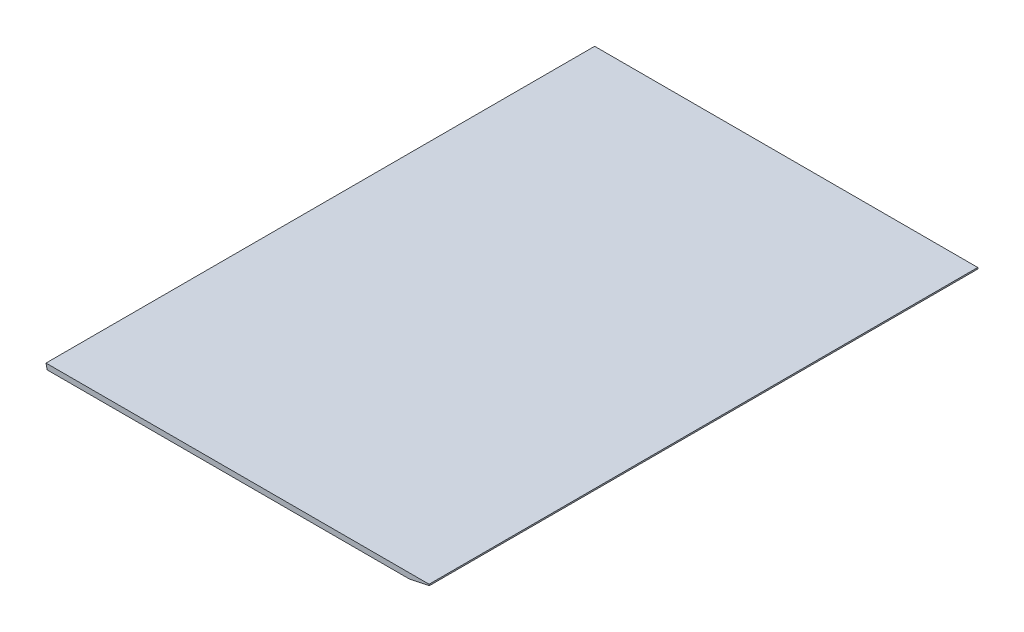
ISO-10303-21;
HEADER;
FILE_DESCRIPTION(('STEP AP214'),'2;1');
FILE_NAME('part.step','',(''),(''),'','','');
FILE_SCHEMA(('AUTOMOTIVE_DESIGN { 1 0 10303 214 1 1 1 1 }'));
ENDSEC;
DATA;
#1=APPLICATION_CONTEXT('core data for automotive mechanical design processes');
#2=APPLICATION_PROTOCOL_DEFINITION('international standard','automotive_design',2000,#1);
#3=PRODUCT_CONTEXT('',#1,'mechanical');
#4=PRODUCT('Part','Part','',(#3));
#5=PRODUCT_RELATED_PRODUCT_CATEGORY('part','',(#4));
#6=PRODUCT_DEFINITION_FORMATION('','',#4);
#7=PRODUCT_DEFINITION_CONTEXT('part definition',#1,'design');
#8=PRODUCT_DEFINITION('design','',#6,#7);
#9=PRODUCT_DEFINITION_SHAPE('','',#8);
#10=(LENGTH_UNIT() NAMED_UNIT(*) SI_UNIT(.MILLI.,.METRE.));
#11=(NAMED_UNIT(*) PLANE_ANGLE_UNIT() SI_UNIT($,.RADIAN.));
#12=(NAMED_UNIT(*) SI_UNIT($,.STERADIAN.) SOLID_ANGLE_UNIT());
#13=UNCERTAINTY_MEASURE_WITH_UNIT(LENGTH_MEASURE(1.E-05),#10,'distance_accuracy_value','');
#14=(GEOMETRIC_REPRESENTATION_CONTEXT(3) GLOBAL_UNCERTAINTY_ASSIGNED_CONTEXT((#13)) GLOBAL_UNIT_ASSIGNED_CONTEXT((#10,
#11,#12)) REPRESENTATION_CONTEXT('',''));
#15=CARTESIAN_POINT('',(0.,0.,0.));
#16=DIRECTION('',(0.,0.,1.));
#17=DIRECTION('',(1.,0.,0.));
#18=AXIS2_PLACEMENT_3D('',#15,#16,#17);
#19=CARTESIAN_POINT('',(-432.054,11.90625,-609.6));
#20=DIRECTION('',(0.,0.,1.));
#21=DIRECTION('',(1.,0.,0.));
#22=AXIS2_PLACEMENT_3D('',#19,#20,#21);
#23=PLANE('',#22);
#24=DIRECTION('',(-1.,0.,0.));
#25=VECTOR('',#24,1.);
#26=CARTESIAN_POINT('',(-432.054,11.90625,-609.6));
#27=LINE('',#26,#25);
#28=CARTESIAN_POINT('',(419.192503686376,11.90625,-609.6));
#29=VERTEX_POINT('',#28);
#30=CARTESIAN_POINT('',(-432.054,11.90625,-609.6));
#31=VERTEX_POINT('',#30);
#32=EDGE_CURVE('E111',#29,#31,#27,.T.);
#33=ORIENTED_EDGE('',*,*,#32,.F.);
#34=DIRECTION('',(-0.207554642269286,0.978223425640824,0.));
#35=VECTOR('',#34,1.);
#36=CARTESIAN_POINT('',(419.747516344646,9.29042614796967,-609.6));
#37=LINE('',#36,#35);
#38=CARTESIAN_POINT('',(419.747516344646,9.29042614796967,-609.6));
#39=VERTEX_POINT('',#38);
#40=EDGE_CURVE('E91',#39,#29,#37,.T.);
#41=ORIENTED_EDGE('',*,*,#40,.F.);
#42=DIRECTION('',(-0.978147600733805,-0.207911690817761,0.));
#43=VECTOR('',#42,1.);
#44=CARTESIAN_POINT('',(432.054,11.9062500000001,-609.6));
#45=LINE('',#44,#43);
#46=CARTESIAN_POINT('',(376.039497759022,0.,-609.6));
#47=VERTEX_POINT('',#46);
#48=EDGE_CURVE('E124',#39,#47,#45,.T.);
#49=ORIENTED_EDGE('',*,*,#48,.T.);
#50=DIRECTION('',(-1.,0.,0.));
#51=VECTOR('',#50,1.);
#52=CARTESIAN_POINT('',(-432.054,0.,-609.6));
#53=LINE('',#52,#51);
#54=CARTESIAN_POINT('',(-429.523248437616,0.,-609.6));
#55=VERTEX_POINT('',#54);
#56=EDGE_CURVE('E115',#47,#55,#53,.T.);
#57=ORIENTED_EDGE('',*,*,#56,.T.);
#58=DIRECTION('',(-0.207911690817751,0.978147600733807,0.));
#59=VECTOR('',#58,1.);
#60=CARTESIAN_POINT('',(-432.054,11.9062500000005,-609.6));
#61=LINE('',#60,#59);
#62=EDGE_CURVE('E121',#55,#31,#61,.T.);
#63=ORIENTED_EDGE('',*,*,#62,.T.);
#64=EDGE_LOOP('',(#33,#41,#49,#57,#63));
#65=FACE_BOUND('',#64,.T.);
#66=ADVANCED_FACE('F41',(#65),#23,.F.);
#67=CARTESIAN_POINT('',(-432.054,11.90625,609.6));
#68=DIRECTION('',(0.,0.,-1.));
#69=DIRECTION('',(-1.,0.,0.));
#70=AXIS2_PLACEMENT_3D('',#67,#68,#69);
#71=PLANE('',#70);
#72=DIRECTION('',(0.978147600733805,0.207911690817761,0.));
#73=VECTOR('',#72,1.);
#74=CARTESIAN_POINT('',(432.054,11.9062500000001,609.6));
#75=LINE('',#74,#73);
#76=CARTESIAN_POINT('',(376.039497759022,0.,609.6));
#77=VERTEX_POINT('',#76);
#78=CARTESIAN_POINT('',(419.747516344646,9.29042614796967,609.6));
#79=VERTEX_POINT('',#78);
#80=EDGE_CURVE('E11',#77,#79,#75,.T.);
#81=ORIENTED_EDGE('',*,*,#80,.T.);
#82=DIRECTION('',(-0.207554642269286,0.978223425640824,0.));
#83=VECTOR('',#82,1.);
#84=CARTESIAN_POINT('',(419.747516344646,9.29042614796967,609.6));
#85=LINE('',#84,#83);
#86=CARTESIAN_POINT('',(419.192503686376,11.90625,609.6));
#87=VERTEX_POINT('',#86);
#88=EDGE_CURVE('E57',#79,#87,#85,.T.);
#89=ORIENTED_EDGE('',*,*,#88,.T.);
#90=DIRECTION('',(1.,0.,0.));
#91=VECTOR('',#90,1.);
#92=CARTESIAN_POINT('',(-432.054,11.90625,609.6));
#93=LINE('',#92,#91);
#94=CARTESIAN_POINT('',(-432.054,11.90625,609.6));
#95=VERTEX_POINT('',#94);
#96=EDGE_CURVE('E100',#95,#87,#93,.T.);
#97=ORIENTED_EDGE('',*,*,#96,.F.);
#98=DIRECTION('',(0.207911690817751,-0.978147600733807,0.));
#99=VECTOR('',#98,1.);
#100=CARTESIAN_POINT('',(-432.054,11.9062500000005,609.6));
#101=LINE('',#100,#99);
#102=CARTESIAN_POINT('',(-429.523248437616,0.,609.6));
#103=VERTEX_POINT('',#102);
#104=EDGE_CURVE('E107',#95,#103,#101,.T.);
#105=ORIENTED_EDGE('',*,*,#104,.T.);
#106=DIRECTION('',(1.,0.,0.));
#107=VECTOR('',#106,1.);
#108=CARTESIAN_POINT('',(-432.054,0.,609.6));
#109=LINE('',#108,#107);
#110=EDGE_CURVE('E117',#103,#77,#109,.T.);
#111=ORIENTED_EDGE('',*,*,#110,.T.);
#112=EDGE_LOOP('',(#81,#89,#97,#105,#111));
#113=FACE_BOUND('',#112,.T.);
#114=ADVANCED_FACE('F99',(#113),#71,.F.);
#115=CARTESIAN_POINT('',(0.,11.90625,0.));
#116=DIRECTION('',(0.,-1.,0.));
#117=DIRECTION('',(0.,0.,-1.));
#118=AXIS2_PLACEMENT_3D('',#115,#116,#117);
#119=PLANE('',#118);
#120=ORIENTED_EDGE('',*,*,#96,.T.);
#121=DIRECTION('',(0.,0.,-1.));
#122=VECTOR('',#121,1.);
#123=CARTESIAN_POINT('',(419.192503686376,11.90625,609.6));
#124=LINE('',#123,#122);
#125=EDGE_CURVE('E88',#87,#29,#124,.T.);
#126=ORIENTED_EDGE('',*,*,#125,.T.);
#127=ORIENTED_EDGE('',*,*,#32,.T.);
#128=DIRECTION('',(0.,0.,1.));
#129=VECTOR('',#128,1.);
#130=CARTESIAN_POINT('',(-432.054,11.90625,609.6));
#131=LINE('',#130,#129);
#132=EDGE_CURVE('E106',#31,#95,#131,.T.);
#133=ORIENTED_EDGE('',*,*,#132,.T.);
#134=EDGE_LOOP('',(#120,#126,#127,#133));
#135=FACE_BOUND('',#134,.T.);
#136=ADVANCED_FACE('F104',(#135),#119,.F.);
#137=CARTESIAN_POINT('',(0.,0.,0.));
#138=DIRECTION('',(0.,-1.,0.));
#139=DIRECTION('',(0.,0.,-1.));
#140=AXIS2_PLACEMENT_3D('',#137,#138,#139);
#141=PLANE('',#140);
#142=ORIENTED_EDGE('',*,*,#56,.F.);
#143=DIRECTION('',(0.,0.,1.));
#144=VECTOR('',#143,1.);
#145=CARTESIAN_POINT('',(376.039497759022,0.,609.6));
#146=LINE('',#145,#144);
#147=EDGE_CURVE('E50',#47,#77,#146,.T.);
#148=ORIENTED_EDGE('',*,*,#147,.T.);
#149=ORIENTED_EDGE('',*,*,#110,.F.);
#150=DIRECTION('',(0.,0.,-1.));
#151=VECTOR('',#150,1.);
#152=CARTESIAN_POINT('',(-429.523248437616,0.,-609.6));
#153=LINE('',#152,#151);
#154=EDGE_CURVE('E109',#103,#55,#153,.T.);
#155=ORIENTED_EDGE('',*,*,#154,.T.);
#156=EDGE_LOOP('',(#142,#148,#149,#155));
#157=FACE_BOUND('',#156,.T.);
#158=ADVANCED_FACE('F128',(#157),#141,.T.);
#159=CARTESIAN_POINT('',(-432.054,11.9062500000005,609.6));
#160=DIRECTION('',(-0.978147600733807,-0.207911690817751,0.));
#161=DIRECTION('',(0.,0.,-1.));
#162=AXIS2_PLACEMENT_3D('',#159,#160,#161);
#163=PLANE('',#162);
#164=ORIENTED_EDGE('',*,*,#62,.F.);
#165=ORIENTED_EDGE('',*,*,#154,.F.);
#166=ORIENTED_EDGE('',*,*,#104,.F.);
#167=ORIENTED_EDGE('',*,*,#132,.F.);
#168=EDGE_LOOP('',(#164,#165,#166,#167));
#169=FACE_BOUND('',#168,.T.);
#170=ADVANCED_FACE('F134',(#169),#163,.T.);
#171=CARTESIAN_POINT('',(432.054,11.9062500000001,609.6));
#172=DIRECTION('',(0.207911690817761,-0.978147600733805,0.));
#173=DIRECTION('',(0.,0.,1.));
#174=AXIS2_PLACEMENT_3D('',#171,#172,#173);
#175=PLANE('',#174);
#176=DIRECTION('',(0.,0.,-1.));
#177=VECTOR('',#176,1.);
#178=CARTESIAN_POINT('',(419.747516344646,9.29042614796967,609.6));
#179=LINE('',#178,#177);
#180=EDGE_CURVE('E95',#79,#39,#179,.T.);
#181=ORIENTED_EDGE('',*,*,#180,.F.);
#182=ORIENTED_EDGE('',*,*,#80,.F.);
#183=ORIENTED_EDGE('',*,*,#147,.F.);
#184=ORIENTED_EDGE('',*,*,#48,.F.);
#185=EDGE_LOOP('',(#181,#182,#183,#184));
#186=FACE_BOUND('',#185,.T.);
#187=ADVANCED_FACE('F44',(#186),#175,.T.);
#188=CARTESIAN_POINT('',(419.747516344646,9.29042614796967,609.6));
#189=DIRECTION('',(-0.978223425640824,-0.207554642269286,0.));
#190=DIRECTION('',(0.207554642269286,-0.978223425640824,0.));
#191=AXIS2_PLACEMENT_3D('',#188,#189,#190);
#192=PLANE('',#191);
#193=ORIENTED_EDGE('',*,*,#40,.T.);
#194=ORIENTED_EDGE('',*,*,#125,.F.);
#195=ORIENTED_EDGE('',*,*,#88,.F.);
#196=ORIENTED_EDGE('',*,*,#180,.T.);
#197=EDGE_LOOP('',(#193,#194,#195,#196));
#198=FACE_BOUND('',#197,.T.);
#199=ADVANCED_FACE('F89',(#198),#192,.F.);
#200=CLOSED_SHELL('',(#66,#114,#136,#158,#170,#187,#199));
#201=MANIFOLD_SOLID_BREP('B2',#200);
#202=ADVANCED_BREP_SHAPE_REPRESENTATION('',(#18,#201),#14);
#203=SHAPE_DEFINITION_REPRESENTATION(#9,#202);
ENDSEC;
END-ISO-10303-21;
